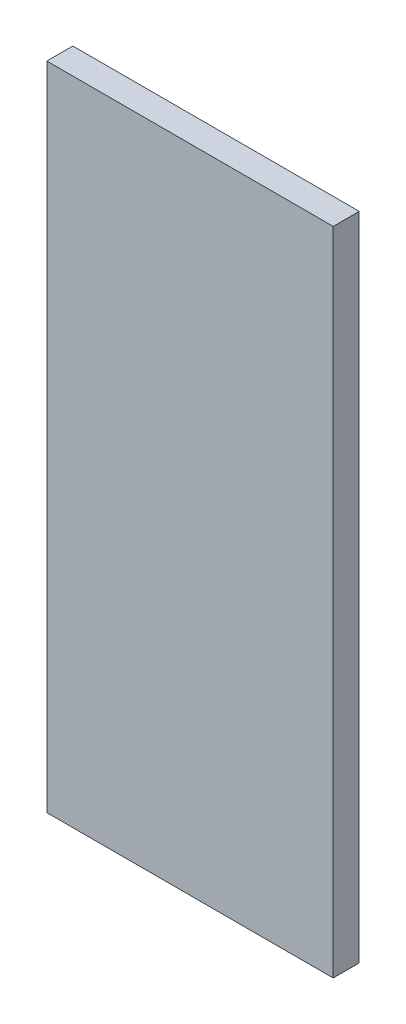
ISO-10303-21;
HEADER;
FILE_DESCRIPTION(('STEP AP214'),'2;1');
FILE_NAME('part.step','',(''),(''),'','','');
FILE_SCHEMA(('AUTOMOTIVE_DESIGN { 1 0 10303 214 1 1 1 1 }'));
ENDSEC;
DATA;
#1=APPLICATION_CONTEXT('core data for automotive mechanical design processes');
#2=APPLICATION_PROTOCOL_DEFINITION('international standard','automotive_design',2000,#1);
#3=PRODUCT_CONTEXT('',#1,'mechanical');
#4=PRODUCT('Part','Part','',(#3));
#5=PRODUCT_RELATED_PRODUCT_CATEGORY('part','',(#4));
#6=PRODUCT_DEFINITION_FORMATION('','',#4);
#7=PRODUCT_DEFINITION_CONTEXT('part definition',#1,'design');
#8=PRODUCT_DEFINITION('design','',#6,#7);
#9=PRODUCT_DEFINITION_SHAPE('','',#8);
#10=(LENGTH_UNIT() NAMED_UNIT(*) SI_UNIT(.MILLI.,.METRE.));
#11=(NAMED_UNIT(*) PLANE_ANGLE_UNIT() SI_UNIT($,.RADIAN.));
#12=(NAMED_UNIT(*) SI_UNIT($,.STERADIAN.) SOLID_ANGLE_UNIT());
#13=UNCERTAINTY_MEASURE_WITH_UNIT(LENGTH_MEASURE(1.E-05),#10,'distance_accuracy_value','');
#14=(GEOMETRIC_REPRESENTATION_CONTEXT(3) GLOBAL_UNCERTAINTY_ASSIGNED_CONTEXT((#13)) GLOBAL_UNIT_ASSIGNED_CONTEXT((#10,
#11,#12)) REPRESENTATION_CONTEXT('',''));
#15=CARTESIAN_POINT('',(0.,0.,0.));
#16=DIRECTION('',(0.,0.,1.));
#17=DIRECTION('',(1.,0.,0.));
#18=AXIS2_PLACEMENT_3D('',#15,#16,#17);
#19=CARTESIAN_POINT('',(-9.1740130367215,29.878159859311,2.));
#20=DIRECTION('',(0.,-1.,0.));
#21=DIRECTION('',(0.,0.,-1.));
#22=AXIS2_PLACEMENT_3D('',#19,#20,#21);
#23=PLANE('',#22);
#24=DIRECTION('',(-1.,0.,0.));
#25=VECTOR('',#24,1.);
#26=CARTESIAN_POINT('',(-9.1740130367215,29.878159859311,0.));
#27=LINE('',#26,#25);
#28=CARTESIAN_POINT('',(12.8259869632785,29.878159859311,0.));
#29=VERTEX_POINT('',#28);
#30=CARTESIAN_POINT('',(-9.1740130367215,29.878159859311,0.));
#31=VERTEX_POINT('',#30);
#32=EDGE_CURVE('E113',#29,#31,#27,.T.);
#33=ORIENTED_EDGE('',*,*,#32,.T.);
#34=DIRECTION('',(0.,0.,-1.));
#35=VECTOR('',#34,1.);
#36=CARTESIAN_POINT('',(-9.1740130367215,29.878159859311,2.));
#37=LINE('',#36,#35);
#38=CARTESIAN_POINT('',(-9.1740130367215,29.878159859311,2.));
#39=VERTEX_POINT('',#38);
#40=EDGE_CURVE('E11',#39,#31,#37,.T.);
#41=ORIENTED_EDGE('',*,*,#40,.F.);
#42=DIRECTION('',(-1.,0.,0.));
#43=VECTOR('',#42,1.);
#44=CARTESIAN_POINT('',(-9.1740130367215,29.878159859311,2.));
#45=LINE('',#44,#43);
#46=CARTESIAN_POINT('',(12.8259869632785,29.878159859311,2.));
#47=VERTEX_POINT('',#46);
#48=EDGE_CURVE('E97',#47,#39,#45,.T.);
#49=ORIENTED_EDGE('',*,*,#48,.F.);
#50=DIRECTION('',(0.,0.,-1.));
#51=VECTOR('',#50,1.);
#52=CARTESIAN_POINT('',(12.8259869632785,29.878159859311,2.));
#53=LINE('',#52,#51);
#54=EDGE_CURVE('E109',#47,#29,#53,.T.);
#55=ORIENTED_EDGE('',*,*,#54,.T.);
#56=EDGE_LOOP('',(#33,#41,#49,#55));
#57=FACE_BOUND('',#56,.T.);
#58=ADVANCED_FACE('F45',(#57),#23,.F.);
#59=CARTESIAN_POINT('',(-9.1740130367215,-20.121840140689,2.));
#60=DIRECTION('',(1.,0.,0.));
#61=DIRECTION('',(0.,0.,-1.));
#62=AXIS2_PLACEMENT_3D('',#59,#60,#61);
#63=PLANE('',#62);
#64=DIRECTION('',(0.,-1.,0.));
#65=VECTOR('',#64,1.);
#66=CARTESIAN_POINT('',(-9.1740130367215,-20.121840140689,0.));
#67=LINE('',#66,#65);
#68=CARTESIAN_POINT('',(-9.1740130367215,-20.121840140689,0.));
#69=VERTEX_POINT('',#68);
#70=EDGE_CURVE('E102',#31,#69,#67,.T.);
#71=ORIENTED_EDGE('',*,*,#70,.T.);
#72=DIRECTION('',(0.,0.,-1.));
#73=VECTOR('',#72,1.);
#74=CARTESIAN_POINT('',(-9.1740130367215,-20.121840140689,2.));
#75=LINE('',#74,#73);
#76=CARTESIAN_POINT('',(-9.1740130367215,-20.121840140689,2.));
#77=VERTEX_POINT('',#76);
#78=EDGE_CURVE('E54',#77,#69,#75,.T.);
#79=ORIENTED_EDGE('',*,*,#78,.F.);
#80=DIRECTION('',(0.,-1.,0.));
#81=VECTOR('',#80,1.);
#82=CARTESIAN_POINT('',(-9.1740130367215,-20.121840140689,2.));
#83=LINE('',#82,#81);
#84=EDGE_CURVE('E92',#39,#77,#83,.T.);
#85=ORIENTED_EDGE('',*,*,#84,.F.);
#86=ORIENTED_EDGE('',*,*,#40,.T.);
#87=EDGE_LOOP('',(#71,#79,#85,#86));
#88=FACE_BOUND('',#87,.T.);
#89=ADVANCED_FACE('F101',(#88),#63,.F.);
#90=CARTESIAN_POINT('',(12.8259869632785,-20.121840140689,2.));
#91=DIRECTION('',(0.,1.,0.));
#92=DIRECTION('',(0.,0.,1.));
#93=AXIS2_PLACEMENT_3D('',#90,#91,#92);
#94=PLANE('',#93);
#95=DIRECTION('',(1.,0.,0.));
#96=VECTOR('',#95,1.);
#97=CARTESIAN_POINT('',(12.8259869632785,-20.121840140689,0.));
#98=LINE('',#97,#96);
#99=CARTESIAN_POINT('',(12.8259869632785,-20.121840140689,0.));
#100=VERTEX_POINT('',#99);
#101=EDGE_CURVE('E79',#69,#100,#98,.T.);
#102=ORIENTED_EDGE('',*,*,#101,.T.);
#103=DIRECTION('',(0.,0.,-1.));
#104=VECTOR('',#103,1.);
#105=CARTESIAN_POINT('',(12.8259869632785,-20.121840140689,2.));
#106=LINE('',#105,#104);
#107=CARTESIAN_POINT('',(12.8259869632785,-20.121840140689,2.));
#108=VERTEX_POINT('',#107);
#109=EDGE_CURVE('E104',#108,#100,#106,.T.);
#110=ORIENTED_EDGE('',*,*,#109,.F.);
#111=DIRECTION('',(1.,0.,0.));
#112=VECTOR('',#111,1.);
#113=CARTESIAN_POINT('',(12.8259869632785,-20.121840140689,2.));
#114=LINE('',#113,#112);
#115=EDGE_CURVE('E95',#77,#108,#114,.T.);
#116=ORIENTED_EDGE('',*,*,#115,.F.);
#117=ORIENTED_EDGE('',*,*,#78,.T.);
#118=EDGE_LOOP('',(#102,#110,#116,#117));
#119=FACE_BOUND('',#118,.T.);
#120=ADVANCED_FACE('F105',(#119),#94,.F.);
#121=CARTESIAN_POINT('',(12.8259869632785,29.878159859311,2.));
#122=DIRECTION('',(-1.,0.,0.));
#123=DIRECTION('',(0.,-1.,0.));
#124=AXIS2_PLACEMENT_3D('',#121,#122,#123);
#125=PLANE('',#124);
#126=DIRECTION('',(0.,1.,0.));
#127=VECTOR('',#126,1.);
#128=CARTESIAN_POINT('',(12.8259869632785,29.878159859311,0.));
#129=LINE('',#128,#127);
#130=EDGE_CURVE('E85',#100,#29,#129,.T.);
#131=ORIENTED_EDGE('',*,*,#130,.T.);
#132=ORIENTED_EDGE('',*,*,#54,.F.);
#133=DIRECTION('',(0.,1.,0.));
#134=VECTOR('',#133,1.);
#135=CARTESIAN_POINT('',(12.8259869632785,29.878159859311,2.));
#136=LINE('',#135,#134);
#137=EDGE_CURVE('E62',#108,#47,#136,.T.);
#138=ORIENTED_EDGE('',*,*,#137,.F.);
#139=ORIENTED_EDGE('',*,*,#109,.T.);
#140=EDGE_LOOP('',(#131,#132,#138,#139));
#141=FACE_BOUND('',#140,.T.);
#142=ADVANCED_FACE('F126',(#141),#125,.F.);
#143=CARTESIAN_POINT('',(0.,0.,2.));
#144=DIRECTION('',(0.,0.,-1.));
#145=DIRECTION('',(-1.,0.,0.));
#146=AXIS2_PLACEMENT_3D('',#143,#144,#145);
#147=PLANE('',#146);
#148=ORIENTED_EDGE('',*,*,#48,.T.);
#149=ORIENTED_EDGE('',*,*,#84,.T.);
#150=ORIENTED_EDGE('',*,*,#115,.T.);
#151=ORIENTED_EDGE('',*,*,#137,.T.);
#152=EDGE_LOOP('',(#148,#149,#150,#151));
#153=FACE_BOUND('',#152,.T.);
#154=ADVANCED_FACE('F93',(#153),#147,.F.);
#155=CARTESIAN_POINT('',(0.,0.,0.));
#156=DIRECTION('',(0.,0.,-1.));
#157=DIRECTION('',(-1.,0.,0.));
#158=AXIS2_PLACEMENT_3D('',#155,#156,#157);
#159=PLANE('',#158);
#160=ORIENTED_EDGE('',*,*,#32,.F.);
#161=ORIENTED_EDGE('',*,*,#130,.F.);
#162=ORIENTED_EDGE('',*,*,#101,.F.);
#163=ORIENTED_EDGE('',*,*,#70,.F.);
#164=EDGE_LOOP('',(#160,#161,#162,#163));
#165=FACE_BOUND('',#164,.T.);
#166=ADVANCED_FACE('F129',(#165),#159,.T.);
#167=CLOSED_SHELL('',(#58,#89,#120,#142,#154,#166));
#168=MANIFOLD_SOLID_BREP('B2',#167);
#169=ADVANCED_BREP_SHAPE_REPRESENTATION('',(#18,#168),#14);
#170=SHAPE_DEFINITION_REPRESENTATION(#9,#169);
ENDSEC;
END-ISO-10303-21;
